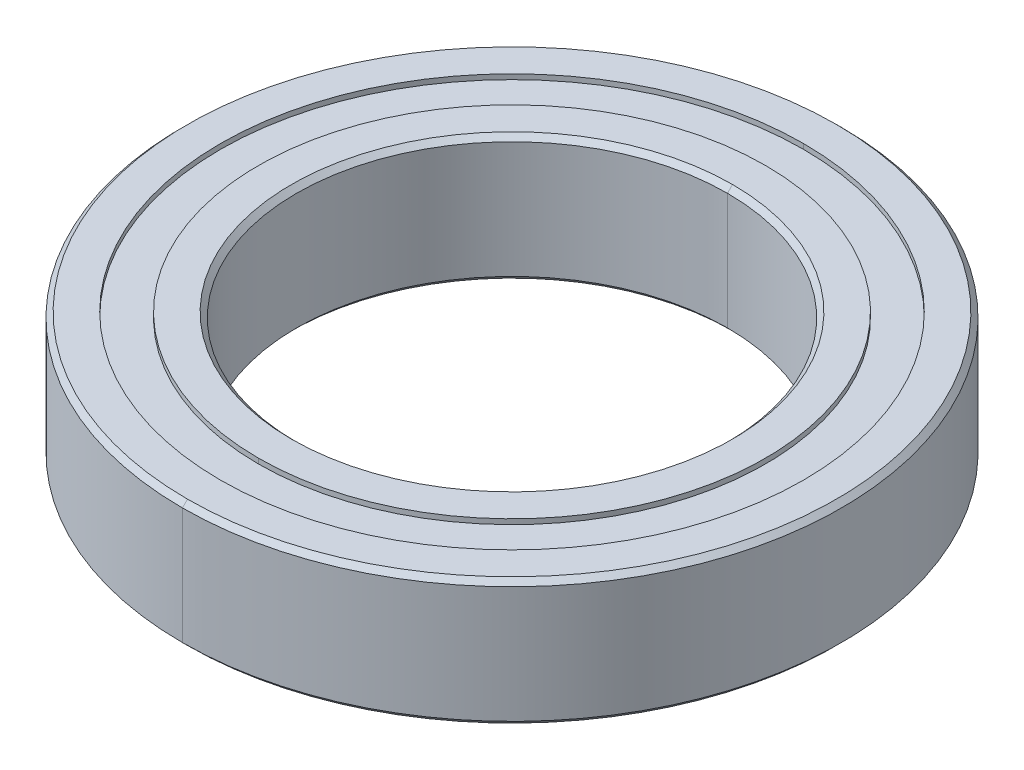
ISO-10303-21;
HEADER;
FILE_DESCRIPTION(('STEP AP214'),'2;1');
FILE_NAME('part.step','',(''),(''),'','','');
FILE_SCHEMA(('AUTOMOTIVE_DESIGN { 1 0 10303 214 1 1 1 1 }'));
ENDSEC;
DATA;
#1=APPLICATION_CONTEXT('core data for automotive mechanical design processes');
#2=APPLICATION_PROTOCOL_DEFINITION('international standard','automotive_design',2000,#1);
#3=PRODUCT_CONTEXT('',#1,'mechanical');
#4=PRODUCT('Part','Part','',(#3));
#5=PRODUCT_RELATED_PRODUCT_CATEGORY('part','',(#4));
#6=PRODUCT_DEFINITION_FORMATION('','',#4);
#7=PRODUCT_DEFINITION_CONTEXT('part definition',#1,'design');
#8=PRODUCT_DEFINITION('design','',#6,#7);
#9=PRODUCT_DEFINITION_SHAPE('','',#8);
#10=(LENGTH_UNIT() NAMED_UNIT(*) SI_UNIT(.MILLI.,.METRE.));
#11=(NAMED_UNIT(*) PLANE_ANGLE_UNIT() SI_UNIT($,.RADIAN.));
#12=(NAMED_UNIT(*) SI_UNIT($,.STERADIAN.) SOLID_ANGLE_UNIT());
#13=UNCERTAINTY_MEASURE_WITH_UNIT(LENGTH_MEASURE(1.E-05),#10,'distance_accuracy_value','');
#14=(GEOMETRIC_REPRESENTATION_CONTEXT(3) GLOBAL_UNCERTAINTY_ASSIGNED_CONTEXT((#13)) GLOBAL_UNIT_ASSIGNED_CONTEXT((#10,
#11,#12)) REPRESENTATION_CONTEXT('',''));
#15=CARTESIAN_POINT('',(0.,0.,0.));
#16=DIRECTION('',(0.,0.,1.));
#17=DIRECTION('',(1.,0.,0.));
#18=AXIS2_PLACEMENT_3D('',#15,#16,#17);
#19=CARTESIAN_POINT('',(0.,0.,0.));
#20=DIRECTION('',(0.,-1.,0.));
#21=DIRECTION('',(0.,0.,-1.));
#22=AXIS2_PLACEMENT_3D('',#19,#20,#21);
#23=CONICAL_SURFACE('',#22,8.7,0.785398163397443);
#24=DIRECTION('',(0.,-0.707106781186551,0.707106781186545));
#25=VECTOR('',#24,1.);
#26=CARTESIAN_POINT('',(0.,0.,8.7));
#27=LINE('',#26,#25);
#28=CARTESIAN_POINT('',(0.,0.2,8.5));
#29=VERTEX_POINT('',#28);
#30=CARTESIAN_POINT('',(0.,0.,8.7));
#31=VERTEX_POINT('',#30);
#32=EDGE_CURVE('E175',#29,#31,#27,.T.);
#33=ORIENTED_EDGE('',*,*,#32,.F.);
#34=CARTESIAN_POINT('',(0.,0.2,0.));
#35=DIRECTION('',(0.,-1.,0.));
#36=DIRECTION('',(0.,0.,1.));
#37=AXIS2_PLACEMENT_3D('',#34,#35,#36);
#38=CIRCLE('',#37,8.5);
#39=CARTESIAN_POINT('',(0.,0.2,-8.5));
#40=VERTEX_POINT('',#39);
#41=EDGE_CURVE('E166',#40,#29,#38,.T.);
#42=ORIENTED_EDGE('',*,*,#41,.F.);
#43=DIRECTION('',(0.,-0.707106781186551,-0.707106781186545));
#44=VECTOR('',#43,1.);
#45=CARTESIAN_POINT('',(0.,0.,-8.7));
#46=LINE('',#45,#44);
#47=CARTESIAN_POINT('',(0.,0.,-8.7));
#48=VERTEX_POINT('',#47);
#49=EDGE_CURVE('E172',#40,#48,#46,.T.);
#50=ORIENTED_EDGE('',*,*,#49,.T.);
#51=CARTESIAN_POINT('',(0.,0.,0.));
#52=DIRECTION('',(0.,1.,0.));
#53=DIRECTION('',(0.,0.,1.));
#54=AXIS2_PLACEMENT_3D('',#51,#52,#53);
#55=CIRCLE('',#54,8.7);
#56=EDGE_CURVE('E342',#31,#48,#55,.T.);
#57=ORIENTED_EDGE('',*,*,#56,.F.);
#58=EDGE_LOOP('',(#33,#42,#50,#57));
#59=FACE_BOUND('',#58,.T.);
#60=ADVANCED_FACE('F18',(#59),#23,.F.);
#61=CARTESIAN_POINT('',(0.,4.8,0.));
#62=DIRECTION('',(0.,1.,0.));
#63=DIRECTION('',(0.,0.,1.));
#64=AXIS2_PLACEMENT_3D('',#61,#62,#63);
#65=CONICAL_SURFACE('',#64,8.5,0.785398163397457);
#66=DIRECTION('',(0.,0.707106781186542,-0.707106781186554));
#67=VECTOR('',#66,1.);
#68=CARTESIAN_POINT('',(0.,4.8,-8.5));
#69=LINE('',#68,#67);
#70=CARTESIAN_POINT('',(0.,4.8,-8.5));
#71=VERTEX_POINT('',#70);
#72=CARTESIAN_POINT('',(0.,5.,-8.7));
#73=VERTEX_POINT('',#72);
#74=EDGE_CURVE('E219',#71,#73,#69,.T.);
#75=ORIENTED_EDGE('',*,*,#74,.F.);
#76=CARTESIAN_POINT('',(0.,4.8,0.));
#77=DIRECTION('',(0.,1.,0.));
#78=DIRECTION('',(0.,0.,1.));
#79=AXIS2_PLACEMENT_3D('',#76,#77,#78);
#80=CIRCLE('',#79,8.5);
#81=CARTESIAN_POINT('',(0.,4.8,8.5));
#82=VERTEX_POINT('',#81);
#83=EDGE_CURVE('E181',#82,#71,#80,.T.);
#84=ORIENTED_EDGE('',*,*,#83,.F.);
#85=DIRECTION('',(0.,0.707106781186542,0.707106781186554));
#86=VECTOR('',#85,1.);
#87=CARTESIAN_POINT('',(0.,4.8,8.5));
#88=LINE('',#87,#86);
#89=CARTESIAN_POINT('',(0.,5.,8.7));
#90=VERTEX_POINT('',#89);
#91=EDGE_CURVE('E226',#82,#90,#88,.T.);
#92=ORIENTED_EDGE('',*,*,#91,.T.);
#93=CARTESIAN_POINT('',(0.,5.,0.));
#94=DIRECTION('',(0.,-1.,0.));
#95=DIRECTION('',(0.,0.,1.));
#96=AXIS2_PLACEMENT_3D('',#93,#94,#95);
#97=CIRCLE('',#96,8.7);
#98=EDGE_CURVE('E213',#73,#90,#97,.T.);
#99=ORIENTED_EDGE('',*,*,#98,.F.);
#100=EDGE_LOOP('',(#75,#84,#92,#99));
#101=FACE_BOUND('',#100,.T.);
#102=ADVANCED_FACE('F428',(#101),#65,.F.);
#103=CARTESIAN_POINT('',(0.,0.199999999999997,0.));
#104=DIRECTION('',(0.,1.,0.));
#105=DIRECTION('',(0.,0.,1.));
#106=AXIS2_PLACEMENT_3D('',#103,#104,#105);
#107=CONICAL_SURFACE('',#106,13.,0.785398163397448);
#108=DIRECTION('',(0.,0.707106781186548,-0.707106781186548));
#109=VECTOR('',#108,1.);
#110=CARTESIAN_POINT('',(0.,0.199999999999997,-13.));
#111=LINE('',#110,#109);
#112=CARTESIAN_POINT('',(0.,0.,-12.8));
#113=VERTEX_POINT('',#112);
#114=CARTESIAN_POINT('',(0.,0.199999999999997,-13.));
#115=VERTEX_POINT('',#114);
#116=EDGE_CURVE('E223',#113,#115,#111,.T.);
#117=ORIENTED_EDGE('',*,*,#116,.F.);
#118=CARTESIAN_POINT('',(0.,0.,0.));
#119=DIRECTION('',(0.,-1.,0.));
#120=DIRECTION('',(0.,0.,1.));
#121=AXIS2_PLACEMENT_3D('',#118,#119,#120);
#122=CIRCLE('',#121,12.8);
#123=CARTESIAN_POINT('',(0.,0.,12.8));
#124=VERTEX_POINT('',#123);
#125=EDGE_CURVE('E353',#124,#113,#122,.T.);
#126=ORIENTED_EDGE('',*,*,#125,.F.);
#127=DIRECTION('',(0.,0.707106781186548,0.707106781186548));
#128=VECTOR('',#127,1.);
#129=CARTESIAN_POINT('',(0.,0.199999999999997,13.));
#130=LINE('',#129,#128);
#131=CARTESIAN_POINT('',(0.,0.199999999999997,13.));
#132=VERTEX_POINT('',#131);
#133=EDGE_CURVE('E243',#124,#132,#130,.T.);
#134=ORIENTED_EDGE('',*,*,#133,.T.);
#135=CARTESIAN_POINT('',(0.,0.199999999999997,0.));
#136=DIRECTION('',(0.,1.,0.));
#137=DIRECTION('',(0.,0.,1.));
#138=AXIS2_PLACEMENT_3D('',#135,#136,#137);
#139=CIRCLE('',#138,13.);
#140=EDGE_CURVE('E277',#115,#132,#139,.T.);
#141=ORIENTED_EDGE('',*,*,#140,.F.);
#142=EDGE_LOOP('',(#117,#126,#134,#141));
#143=FACE_BOUND('',#142,.T.);
#144=ADVANCED_FACE('F409',(#143),#107,.T.);
#145=CARTESIAN_POINT('',(0.,5.,0.));
#146=DIRECTION('',(0.,-1.,0.));
#147=DIRECTION('',(0.,0.,-1.));
#148=AXIS2_PLACEMENT_3D('',#145,#146,#147);
#149=CONICAL_SURFACE('',#148,12.8,0.785398163397461);
#150=DIRECTION('',(0.,-0.707106781186538,0.707106781186557));
#151=VECTOR('',#150,1.);
#152=CARTESIAN_POINT('',(0.,5.,12.8));
#153=LINE('',#152,#151);
#154=CARTESIAN_POINT('',(0.,5.,12.8));
#155=VERTEX_POINT('',#154);
#156=CARTESIAN_POINT('',(0.,4.8,13.));
#157=VERTEX_POINT('',#156);
#158=EDGE_CURVE('E265',#155,#157,#153,.T.);
#159=ORIENTED_EDGE('',*,*,#158,.F.);
#160=CARTESIAN_POINT('',(0.,5.,0.));
#161=DIRECTION('',(0.,1.,0.));
#162=DIRECTION('',(0.,0.,1.));
#163=AXIS2_PLACEMENT_3D('',#160,#161,#162);
#164=CIRCLE('',#163,12.8);
#165=CARTESIAN_POINT('',(0.,5.,-12.8));
#166=VERTEX_POINT('',#165);
#167=EDGE_CURVE('E216',#166,#155,#164,.T.);
#168=ORIENTED_EDGE('',*,*,#167,.F.);
#169=DIRECTION('',(0.,-0.707106781186538,-0.707106781186557));
#170=VECTOR('',#169,1.);
#171=CARTESIAN_POINT('',(0.,5.,-12.8));
#172=LINE('',#171,#170);
#173=CARTESIAN_POINT('',(0.,4.8,-13.));
#174=VERTEX_POINT('',#173);
#175=EDGE_CURVE('E272',#166,#174,#172,.T.);
#176=ORIENTED_EDGE('',*,*,#175,.T.);
#177=CARTESIAN_POINT('',(0.,4.8,0.));
#178=DIRECTION('',(0.,-1.,0.));
#179=DIRECTION('',(0.,0.,1.));
#180=AXIS2_PLACEMENT_3D('',#177,#178,#179);
#181=CIRCLE('',#180,13.);
#182=EDGE_CURVE('E358',#157,#174,#181,.T.);
#183=ORIENTED_EDGE('',*,*,#182,.F.);
#184=EDGE_LOOP('',(#159,#168,#176,#183));
#185=FACE_BOUND('',#184,.T.);
#186=ADVANCED_FACE('F396',(#185),#149,.T.);
#187=CARTESIAN_POINT('',(0.,0.2,0.));
#188=DIRECTION('',(0.,-1.,0.));
#189=DIRECTION('',(0.,0.,-1.));
#190=AXIS2_PLACEMENT_3D('',#187,#188,#189);
#191=CYLINDRICAL_SURFACE('',#190,10.);
#192=DIRECTION('',(0.,-1.,0.));
#193=VECTOR('',#192,1.);
#194=CARTESIAN_POINT('',(0.,0.2,10.));
#195=LINE('',#194,#193);
#196=CARTESIAN_POINT('',(0.,0.2,10.));
#197=VERTEX_POINT('',#196);
#198=CARTESIAN_POINT('',(0.,0.,10.));
#199=VERTEX_POINT('',#198);
#200=EDGE_CURVE('E290',#197,#199,#195,.T.);
#201=ORIENTED_EDGE('',*,*,#200,.F.);
#202=CARTESIAN_POINT('',(0.,0.2,0.));
#203=DIRECTION('',(0.,-1.,0.));
#204=DIRECTION('',(0.,0.,-1.));
#205=AXIS2_PLACEMENT_3D('',#202,#203,#204);
#206=CIRCLE('',#205,10.);
#207=CARTESIAN_POINT('',(0.,0.2,-10.));
#208=VERTEX_POINT('',#207);
#209=EDGE_CURVE('E11',#197,#208,#206,.T.);
#210=ORIENTED_EDGE('',*,*,#209,.T.);
#211=DIRECTION('',(0.,-1.,0.));
#212=VECTOR('',#211,1.);
#213=CARTESIAN_POINT('',(0.,0.2,-10.));
#214=LINE('',#213,#212);
#215=CARTESIAN_POINT('',(0.,0.,-10.));
#216=VERTEX_POINT('',#215);
#217=EDGE_CURVE('E256',#208,#216,#214,.T.);
#218=ORIENTED_EDGE('',*,*,#217,.T.);
#219=CARTESIAN_POINT('',(0.,0.,0.));
#220=DIRECTION('',(0.,-1.,0.));
#221=DIRECTION('',(0.,0.,-1.));
#222=AXIS2_PLACEMENT_3D('',#219,#220,#221);
#223=CIRCLE('',#222,10.);
#224=EDGE_CURVE('E341',#199,#216,#223,.T.);
#225=ORIENTED_EDGE('',*,*,#224,.F.);
#226=EDGE_LOOP('',(#201,#210,#218,#225));
#227=FACE_BOUND('',#226,.T.);
#228=ADVANCED_FACE('F445',(#227),#191,.T.);
#229=CARTESIAN_POINT('',(0.,0.2,0.));
#230=DIRECTION('',(0.,-1.,0.));
#231=DIRECTION('',(0.,0.,-1.));
#232=AXIS2_PLACEMENT_3D('',#229,#230,#231);
#233=PLANE('',#232);
#234=CARTESIAN_POINT('',(0.,0.2,0.));
#235=DIRECTION('',(0.,-1.,0.));
#236=DIRECTION('',(0.,0.,-1.));
#237=AXIS2_PLACEMENT_3D('',#234,#235,#236);
#238=CIRCLE('',#237,10.);
#239=EDGE_CURVE('E278',#208,#197,#238,.T.);
#240=ORIENTED_EDGE('',*,*,#239,.F.);
#241=ORIENTED_EDGE('',*,*,#209,.F.);
#242=EDGE_LOOP('',(#240,#241));
#243=FACE_BOUND('',#242,.T.);
#244=CARTESIAN_POINT('',(0.,0.2,0.));
#245=DIRECTION('',(0.,-1.,0.));
#246=DIRECTION('',(0.,0.,-1.));
#247=AXIS2_PLACEMENT_3D('',#244,#245,#246);
#248=CIRCLE('',#247,11.5);
#249=CARTESIAN_POINT('',(0.,0.2,-11.5));
#250=VERTEX_POINT('',#249);
#251=CARTESIAN_POINT('',(0.,0.2,11.5));
#252=VERTEX_POINT('',#251);
#253=EDGE_CURVE('E27',#250,#252,#248,.T.);
#254=ORIENTED_EDGE('',*,*,#253,.T.);
#255=CARTESIAN_POINT('',(0.,0.2,0.));
#256=DIRECTION('',(0.,-1.,0.));
#257=DIRECTION('',(0.,0.,-1.));
#258=AXIS2_PLACEMENT_3D('',#255,#256,#257);
#259=CIRCLE('',#258,11.5);
#260=EDGE_CURVE('E255',#252,#250,#259,.T.);
#261=ORIENTED_EDGE('',*,*,#260,.T.);
#262=EDGE_LOOP('',(#254,#261));
#263=FACE_BOUND('',#262,.T.);
#264=ADVANCED_FACE('F443',(#243,#263),#233,.T.);
#265=CARTESIAN_POINT('',(0.,0.2,0.));
#266=DIRECTION('',(0.,-1.,0.));
#267=DIRECTION('',(0.,0.,-1.));
#268=AXIS2_PLACEMENT_3D('',#265,#266,#267);
#269=CYLINDRICAL_SURFACE('',#268,11.5);
#270=DIRECTION('',(0.,-1.,0.));
#271=VECTOR('',#270,1.);
#272=CARTESIAN_POINT('',(0.,0.2,11.5));
#273=LINE('',#272,#271);
#274=CARTESIAN_POINT('',(0.,0.,11.5));
#275=VERTEX_POINT('',#274);
#276=EDGE_CURVE('E246',#252,#275,#273,.T.);
#277=ORIENTED_EDGE('',*,*,#276,.F.);
#278=ORIENTED_EDGE('',*,*,#253,.F.);
#279=DIRECTION('',(0.,-1.,0.));
#280=VECTOR('',#279,1.);
#281=CARTESIAN_POINT('',(0.,0.2,-11.5));
#282=LINE('',#281,#280);
#283=CARTESIAN_POINT('',(0.,0.,-11.5));
#284=VERTEX_POINT('',#283);
#285=EDGE_CURVE('E283',#250,#284,#282,.T.);
#286=ORIENTED_EDGE('',*,*,#285,.T.);
#287=CARTESIAN_POINT('',(0.,0.,0.));
#288=DIRECTION('',(0.,-1.,0.));
#289=DIRECTION('',(0.,0.,-1.));
#290=AXIS2_PLACEMENT_3D('',#287,#288,#289);
#291=CIRCLE('',#290,11.5);
#292=EDGE_CURVE('E360',#284,#275,#291,.T.);
#293=ORIENTED_EDGE('',*,*,#292,.T.);
#294=EDGE_LOOP('',(#277,#278,#286,#293));
#295=FACE_BOUND('',#294,.T.);
#296=ADVANCED_FACE('F448',(#295),#269,.F.);
#297=CARTESIAN_POINT('',(0.,4.8,0.));
#298=DIRECTION('',(0.,1.,0.));
#299=DIRECTION('',(0.,0.,1.));
#300=AXIS2_PLACEMENT_3D('',#297,#298,#299);
#301=CYLINDRICAL_SURFACE('',#300,10.);
#302=DIRECTION('',(0.,1.,0.));
#303=VECTOR('',#302,1.);
#304=CARTESIAN_POINT('',(0.,4.8,-10.));
#305=LINE('',#304,#303);
#306=CARTESIAN_POINT('',(0.,4.8,-10.));
#307=VERTEX_POINT('',#306);
#308=CARTESIAN_POINT('',(0.,5.,-10.));
#309=VERTEX_POINT('',#308);
#310=EDGE_CURVE('E308',#307,#309,#305,.T.);
#311=ORIENTED_EDGE('',*,*,#310,.F.);
#312=CARTESIAN_POINT('',(0.,4.8,0.));
#313=DIRECTION('',(0.,1.,0.));
#314=DIRECTION('',(0.,0.,1.));
#315=AXIS2_PLACEMENT_3D('',#312,#313,#314);
#316=CIRCLE('',#315,10.);
#317=CARTESIAN_POINT('',(0.,4.8,10.));
#318=VERTEX_POINT('',#317);
#319=EDGE_CURVE('E264',#307,#318,#316,.T.);
#320=ORIENTED_EDGE('',*,*,#319,.T.);
#321=DIRECTION('',(0.,1.,0.));
#322=VECTOR('',#321,1.);
#323=CARTESIAN_POINT('',(0.,4.8,10.));
#324=LINE('',#323,#322);
#325=CARTESIAN_POINT('',(0.,5.,10.));
#326=VERTEX_POINT('',#325);
#327=EDGE_CURVE('E314',#318,#326,#324,.T.);
#328=ORIENTED_EDGE('',*,*,#327,.T.);
#329=CARTESIAN_POINT('',(0.,5.,0.));
#330=DIRECTION('',(0.,1.,0.));
#331=DIRECTION('',(0.,0.,1.));
#332=AXIS2_PLACEMENT_3D('',#329,#330,#331);
#333=CIRCLE('',#332,10.);
#334=EDGE_CURVE('E220',#309,#326,#333,.T.);
#335=ORIENTED_EDGE('',*,*,#334,.F.);
#336=EDGE_LOOP('',(#311,#320,#328,#335));
#337=FACE_BOUND('',#336,.T.);
#338=ADVANCED_FACE('F375',(#337),#301,.T.);
#339=CARTESIAN_POINT('',(0.,4.8,0.));
#340=DIRECTION('',(0.,1.,0.));
#341=DIRECTION('',(1.,0.,0.));
#342=AXIS2_PLACEMENT_3D('',#339,#340,#341);
#343=PLANE('',#342);
#344=CARTESIAN_POINT('',(0.,4.8,0.));
#345=DIRECTION('',(0.,1.,0.));
#346=DIRECTION('',(0.,0.,1.));
#347=AXIS2_PLACEMENT_3D('',#344,#345,#346);
#348=CIRCLE('',#347,10.);
#349=EDGE_CURVE('E305',#318,#307,#348,.T.);
#350=ORIENTED_EDGE('',*,*,#349,.F.);
#351=ORIENTED_EDGE('',*,*,#319,.F.);
#352=EDGE_LOOP('',(#350,#351));
#353=FACE_BOUND('',#352,.T.);
#354=CARTESIAN_POINT('',(0.,4.8,0.));
#355=DIRECTION('',(0.,1.,0.));
#356=DIRECTION('',(0.,0.,1.));
#357=AXIS2_PLACEMENT_3D('',#354,#355,#356);
#358=CIRCLE('',#357,11.5);
#359=CARTESIAN_POINT('',(0.,4.8,11.5));
#360=VERTEX_POINT('',#359);
#361=CARTESIAN_POINT('',(0.,4.8,-11.5));
#362=VERTEX_POINT('',#361);
#363=EDGE_CURVE('E185',#360,#362,#358,.T.);
#364=ORIENTED_EDGE('',*,*,#363,.T.);
#365=CARTESIAN_POINT('',(0.,4.8,0.));
#366=DIRECTION('',(0.,1.,0.));
#367=DIRECTION('',(0.,0.,1.));
#368=AXIS2_PLACEMENT_3D('',#365,#366,#367);
#369=CIRCLE('',#368,11.5);
#370=EDGE_CURVE('E318',#362,#360,#369,.T.);
#371=ORIENTED_EDGE('',*,*,#370,.T.);
#372=EDGE_LOOP('',(#364,#371));
#373=FACE_BOUND('',#372,.T.);
#374=ADVANCED_FACE('F378',(#353,#373),#343,.T.);
#375=CARTESIAN_POINT('',(0.,4.8,0.));
#376=DIRECTION('',(0.,1.,0.));
#377=DIRECTION('',(0.,0.,1.));
#378=AXIS2_PLACEMENT_3D('',#375,#376,#377);
#379=CYLINDRICAL_SURFACE('',#378,11.5);
#380=DIRECTION('',(0.,1.,0.));
#381=VECTOR('',#380,1.);
#382=CARTESIAN_POINT('',(0.,4.8,-11.5));
#383=LINE('',#382,#381);
#384=CARTESIAN_POINT('',(0.,5.,-11.5));
#385=VERTEX_POINT('',#384);
#386=EDGE_CURVE('E325',#362,#385,#383,.T.);
#387=ORIENTED_EDGE('',*,*,#386,.F.);
#388=ORIENTED_EDGE('',*,*,#363,.F.);
#389=DIRECTION('',(0.,1.,0.));
#390=VECTOR('',#389,1.);
#391=CARTESIAN_POINT('',(0.,4.8,11.5));
#392=LINE('',#391,#390);
#393=CARTESIAN_POINT('',(0.,5.,11.5));
#394=VERTEX_POINT('',#393);
#395=EDGE_CURVE('E329',#360,#394,#392,.T.);
#396=ORIENTED_EDGE('',*,*,#395,.T.);
#397=CARTESIAN_POINT('',(0.,5.,0.));
#398=DIRECTION('',(0.,1.,0.));
#399=DIRECTION('',(0.,0.,1.));
#400=AXIS2_PLACEMENT_3D('',#397,#398,#399);
#401=CIRCLE('',#400,11.5);
#402=EDGE_CURVE('E36',#394,#385,#401,.T.);
#403=ORIENTED_EDGE('',*,*,#402,.T.);
#404=EDGE_LOOP('',(#387,#388,#396,#403));
#405=FACE_BOUND('',#404,.T.);
#406=ADVANCED_FACE('F381',(#405),#379,.F.);
#407=CARTESIAN_POINT('',(0.,5.,0.));
#408=DIRECTION('',(0.,-1.,0.));
#409=DIRECTION('',(0.,0.,-1.));
#410=AXIS2_PLACEMENT_3D('',#407,#408,#409);
#411=CYLINDRICAL_SURFACE('',#410,8.5);
#412=DIRECTION('',(0.,-1.,0.));
#413=VECTOR('',#412,1.);
#414=CARTESIAN_POINT('',(0.,5.,8.5));
#415=LINE('',#414,#413);
#416=EDGE_CURVE('E194',#82,#29,#415,.T.);
#417=ORIENTED_EDGE('',*,*,#416,.F.);
#418=ORIENTED_EDGE('',*,*,#83,.T.);
#419=DIRECTION('',(0.,-1.,0.));
#420=VECTOR('',#419,1.);
#421=CARTESIAN_POINT('',(0.,5.,-8.5));
#422=LINE('',#421,#420);
#423=EDGE_CURVE('E184',#71,#40,#422,.T.);
#424=ORIENTED_EDGE('',*,*,#423,.T.);
#425=ORIENTED_EDGE('',*,*,#41,.T.);
#426=EDGE_LOOP('',(#417,#418,#424,#425));
#427=FACE_BOUND('',#426,.T.);
#428=ADVANCED_FACE('F186',(#427),#411,.F.);
#429=CARTESIAN_POINT('',(0.,5.,0.));
#430=DIRECTION('',(0.,-1.,0.));
#431=DIRECTION('',(0.,0.,-1.));
#432=AXIS2_PLACEMENT_3D('',#429,#430,#431);
#433=CYLINDRICAL_SURFACE('',#432,13.);
#434=DIRECTION('',(0.,-1.,0.));
#435=VECTOR('',#434,1.);
#436=CARTESIAN_POINT('',(0.,5.,13.));
#437=LINE('',#436,#435);
#438=EDGE_CURVE('E195',#157,#132,#437,.T.);
#439=ORIENTED_EDGE('',*,*,#438,.F.);
#440=ORIENTED_EDGE('',*,*,#182,.T.);
#441=DIRECTION('',(0.,-1.,0.));
#442=VECTOR('',#441,1.);
#443=CARTESIAN_POINT('',(0.,5.,-13.));
#444=LINE('',#443,#442);
#445=EDGE_CURVE('E339',#174,#115,#444,.T.);
#446=ORIENTED_EDGE('',*,*,#445,.T.);
#447=ORIENTED_EDGE('',*,*,#140,.T.);
#448=EDGE_LOOP('',(#439,#440,#446,#447));
#449=FACE_BOUND('',#448,.T.);
#450=ADVANCED_FACE('F410',(#449),#433,.T.);
#451=CARTESIAN_POINT('',(0.,0.,0.));
#452=DIRECTION('',(0.,1.,0.));
#453=DIRECTION('',(1.,0.,0.));
#454=AXIS2_PLACEMENT_3D('',#451,#452,#453);
#455=PLANE('',#454);
#456=ORIENTED_EDGE('',*,*,#292,.F.);
#457=CARTESIAN_POINT('',(0.,0.,0.));
#458=DIRECTION('',(0.,-1.,0.));
#459=DIRECTION('',(0.,0.,-1.));
#460=AXIS2_PLACEMENT_3D('',#457,#458,#459);
#461=CIRCLE('',#460,11.5);
#462=EDGE_CURVE('E251',#275,#284,#461,.T.);
#463=ORIENTED_EDGE('',*,*,#462,.F.);
#464=EDGE_LOOP('',(#456,#463));
#465=FACE_BOUND('',#464,.T.);
#466=ORIENTED_EDGE('',*,*,#125,.T.);
#467=CARTESIAN_POINT('',(0.,0.,0.));
#468=DIRECTION('',(0.,-1.,0.));
#469=DIRECTION('',(0.,0.,1.));
#470=AXIS2_PLACEMENT_3D('',#467,#468,#469);
#471=CIRCLE('',#470,12.8);
#472=EDGE_CURVE('E222',#113,#124,#471,.T.);
#473=ORIENTED_EDGE('',*,*,#472,.T.);
#474=EDGE_LOOP('',(#466,#473));
#475=FACE_BOUND('',#474,.T.);
#476=ADVANCED_FACE('F391',(#465,#475),#455,.F.);
#477=CARTESIAN_POINT('',(0.,5.,0.));
#478=DIRECTION('',(0.,1.,0.));
#479=DIRECTION('',(1.,0.,0.));
#480=AXIS2_PLACEMENT_3D('',#477,#478,#479);
#481=PLANE('',#480);
#482=ORIENTED_EDGE('',*,*,#402,.F.);
#483=CARTESIAN_POINT('',(0.,5.,0.));
#484=DIRECTION('',(0.,1.,0.));
#485=DIRECTION('',(0.,0.,1.));
#486=AXIS2_PLACEMENT_3D('',#483,#484,#485);
#487=CIRCLE('',#486,11.5);
#488=EDGE_CURVE('E326',#385,#394,#487,.T.);
#489=ORIENTED_EDGE('',*,*,#488,.F.);
#490=EDGE_LOOP('',(#482,#489));
#491=FACE_BOUND('',#490,.T.);
#492=ORIENTED_EDGE('',*,*,#167,.T.);
#493=CARTESIAN_POINT('',(0.,5.,0.));
#494=DIRECTION('',(0.,1.,0.));
#495=DIRECTION('',(0.,0.,1.));
#496=AXIS2_PLACEMENT_3D('',#493,#494,#495);
#497=CIRCLE('',#496,12.8);
#498=EDGE_CURVE('E249',#155,#166,#497,.T.);
#499=ORIENTED_EDGE('',*,*,#498,.T.);
#500=EDGE_LOOP('',(#492,#499));
#501=FACE_BOUND('',#500,.T.);
#502=ADVANCED_FACE('F390',(#491,#501),#481,.T.);
#503=CARTESIAN_POINT('',(0.,5.,0.));
#504=DIRECTION('',(0.,1.,0.));
#505=DIRECTION('',(1.,0.,0.));
#506=AXIS2_PLACEMENT_3D('',#503,#504,#505);
#507=PLANE('',#506);
#508=CARTESIAN_POINT('',(0.,5.,0.));
#509=DIRECTION('',(0.,-1.,0.));
#510=DIRECTION('',(0.,0.,1.));
#511=AXIS2_PLACEMENT_3D('',#508,#509,#510);
#512=CIRCLE('',#511,8.7);
#513=EDGE_CURVE('E230',#90,#73,#512,.T.);
#514=ORIENTED_EDGE('',*,*,#513,.T.);
#515=ORIENTED_EDGE('',*,*,#98,.T.);
#516=EDGE_LOOP('',(#514,#515));
#517=FACE_BOUND('',#516,.T.);
#518=CARTESIAN_POINT('',(0.,5.,0.));
#519=DIRECTION('',(0.,1.,0.));
#520=DIRECTION('',(0.,0.,1.));
#521=AXIS2_PLACEMENT_3D('',#518,#519,#520);
#522=CIRCLE('',#521,10.);
#523=EDGE_CURVE('E309',#326,#309,#522,.T.);
#524=ORIENTED_EDGE('',*,*,#523,.T.);
#525=ORIENTED_EDGE('',*,*,#334,.T.);
#526=EDGE_LOOP('',(#524,#525));
#527=FACE_BOUND('',#526,.T.);
#528=ADVANCED_FACE('F388',(#517,#527),#507,.T.);
#529=CARTESIAN_POINT('',(0.,0.,0.));
#530=DIRECTION('',(0.,1.,0.));
#531=DIRECTION('',(1.,0.,0.));
#532=AXIS2_PLACEMENT_3D('',#529,#530,#531);
#533=PLANE('',#532);
#534=CARTESIAN_POINT('',(0.,0.,0.));
#535=DIRECTION('',(0.,1.,0.));
#536=DIRECTION('',(0.,0.,1.));
#537=AXIS2_PLACEMENT_3D('',#534,#535,#536);
#538=CIRCLE('',#537,8.7);
#539=EDGE_CURVE('E200',#48,#31,#538,.T.);
#540=ORIENTED_EDGE('',*,*,#539,.T.);
#541=ORIENTED_EDGE('',*,*,#56,.T.);
#542=EDGE_LOOP('',(#540,#541));
#543=FACE_BOUND('',#542,.T.);
#544=CARTESIAN_POINT('',(0.,0.,0.));
#545=DIRECTION('',(0.,-1.,0.));
#546=DIRECTION('',(0.,0.,-1.));
#547=AXIS2_PLACEMENT_3D('',#544,#545,#546);
#548=CIRCLE('',#547,10.);
#549=EDGE_CURVE('E291',#216,#199,#548,.T.);
#550=ORIENTED_EDGE('',*,*,#549,.T.);
#551=ORIENTED_EDGE('',*,*,#224,.T.);
#552=EDGE_LOOP('',(#550,#551));
#553=FACE_BOUND('',#552,.T.);
#554=ADVANCED_FACE('F456',(#543,#553),#533,.F.);
#555=CARTESIAN_POINT('',(0.,5.,0.));
#556=DIRECTION('',(0.,-1.,0.));
#557=DIRECTION('',(0.,0.,-1.));
#558=AXIS2_PLACEMENT_3D('',#555,#556,#557);
#559=CYLINDRICAL_SURFACE('',#558,13.);
#560=CARTESIAN_POINT('',(0.,4.8,0.));
#561=DIRECTION('',(0.,-1.,0.));
#562=DIRECTION('',(0.,0.,1.));
#563=AXIS2_PLACEMENT_3D('',#560,#561,#562);
#564=CIRCLE('',#563,13.);
#565=EDGE_CURVE('E267',#174,#157,#564,.T.);
#566=ORIENTED_EDGE('',*,*,#565,.T.);
#567=ORIENTED_EDGE('',*,*,#438,.T.);
#568=CARTESIAN_POINT('',(0.,0.199999999999997,0.));
#569=DIRECTION('',(0.,1.,0.));
#570=DIRECTION('',(0.,0.,1.));
#571=AXIS2_PLACEMENT_3D('',#568,#569,#570);
#572=CIRCLE('',#571,13.);
#573=EDGE_CURVE('E239',#132,#115,#572,.T.);
#574=ORIENTED_EDGE('',*,*,#573,.T.);
#575=ORIENTED_EDGE('',*,*,#445,.F.);
#576=EDGE_LOOP('',(#566,#567,#574,#575));
#577=FACE_BOUND('',#576,.T.);
#578=ADVANCED_FACE('F402',(#577),#559,.T.);
#579=CARTESIAN_POINT('',(0.,5.,0.));
#580=DIRECTION('',(0.,-1.,0.));
#581=DIRECTION('',(0.,0.,-1.));
#582=AXIS2_PLACEMENT_3D('',#579,#580,#581);
#583=CYLINDRICAL_SURFACE('',#582,8.5);
#584=CARTESIAN_POINT('',(0.,4.8,0.));
#585=DIRECTION('',(0.,1.,0.));
#586=DIRECTION('',(0.,0.,1.));
#587=AXIS2_PLACEMENT_3D('',#584,#585,#586);
#588=CIRCLE('',#587,8.5);
#589=EDGE_CURVE('E203',#71,#82,#588,.T.);
#590=ORIENTED_EDGE('',*,*,#589,.T.);
#591=ORIENTED_EDGE('',*,*,#416,.T.);
#592=CARTESIAN_POINT('',(0.,0.2,0.));
#593=DIRECTION('',(0.,-1.,0.));
#594=DIRECTION('',(0.,0.,1.));
#595=AXIS2_PLACEMENT_3D('',#592,#593,#594);
#596=CIRCLE('',#595,8.5);
#597=EDGE_CURVE('E197',#29,#40,#596,.T.);
#598=ORIENTED_EDGE('',*,*,#597,.T.);
#599=ORIENTED_EDGE('',*,*,#423,.F.);
#600=EDGE_LOOP('',(#590,#591,#598,#599));
#601=FACE_BOUND('',#600,.T.);
#602=ADVANCED_FACE('F201',(#601),#583,.F.);
#603=CARTESIAN_POINT('',(0.,4.8,0.));
#604=DIRECTION('',(0.,1.,0.));
#605=DIRECTION('',(0.,0.,1.));
#606=AXIS2_PLACEMENT_3D('',#603,#604,#605);
#607=CYLINDRICAL_SURFACE('',#606,11.5);
#608=ORIENTED_EDGE('',*,*,#370,.F.);
#609=ORIENTED_EDGE('',*,*,#386,.T.);
#610=ORIENTED_EDGE('',*,*,#488,.T.);
#611=ORIENTED_EDGE('',*,*,#395,.F.);
#612=EDGE_LOOP('',(#608,#609,#610,#611));
#613=FACE_BOUND('',#612,.T.);
#614=ADVANCED_FACE('F387',(#613),#607,.F.);
#615=CARTESIAN_POINT('',(0.,4.8,0.));
#616=DIRECTION('',(0.,1.,0.));
#617=DIRECTION('',(0.,0.,1.));
#618=AXIS2_PLACEMENT_3D('',#615,#616,#617);
#619=CYLINDRICAL_SURFACE('',#618,10.);
#620=ORIENTED_EDGE('',*,*,#349,.T.);
#621=ORIENTED_EDGE('',*,*,#310,.T.);
#622=ORIENTED_EDGE('',*,*,#523,.F.);
#623=ORIENTED_EDGE('',*,*,#327,.F.);
#624=EDGE_LOOP('',(#620,#621,#622,#623));
#625=FACE_BOUND('',#624,.T.);
#626=ADVANCED_FACE('F380',(#625),#619,.T.);
#627=CARTESIAN_POINT('',(0.,0.2,0.));
#628=DIRECTION('',(0.,-1.,0.));
#629=DIRECTION('',(0.,0.,-1.));
#630=AXIS2_PLACEMENT_3D('',#627,#628,#629);
#631=CYLINDRICAL_SURFACE('',#630,11.5);
#632=ORIENTED_EDGE('',*,*,#260,.F.);
#633=ORIENTED_EDGE('',*,*,#276,.T.);
#634=ORIENTED_EDGE('',*,*,#462,.T.);
#635=ORIENTED_EDGE('',*,*,#285,.F.);
#636=EDGE_LOOP('',(#632,#633,#634,#635));
#637=FACE_BOUND('',#636,.T.);
#638=ADVANCED_FACE('F464',(#637),#631,.F.);
#639=CARTESIAN_POINT('',(0.,0.2,0.));
#640=DIRECTION('',(0.,-1.,0.));
#641=DIRECTION('',(0.,0.,-1.));
#642=AXIS2_PLACEMENT_3D('',#639,#640,#641);
#643=CYLINDRICAL_SURFACE('',#642,10.);
#644=ORIENTED_EDGE('',*,*,#239,.T.);
#645=ORIENTED_EDGE('',*,*,#200,.T.);
#646=ORIENTED_EDGE('',*,*,#549,.F.);
#647=ORIENTED_EDGE('',*,*,#217,.F.);
#648=EDGE_LOOP('',(#644,#645,#646,#647));
#649=FACE_BOUND('',#648,.T.);
#650=ADVANCED_FACE('F469',(#649),#643,.T.);
#651=CARTESIAN_POINT('',(0.,5.,0.));
#652=DIRECTION('',(0.,-1.,0.));
#653=DIRECTION('',(0.,0.,-1.));
#654=AXIS2_PLACEMENT_3D('',#651,#652,#653);
#655=CONICAL_SURFACE('',#654,12.8,0.785398163397461);
#656=ORIENTED_EDGE('',*,*,#498,.F.);
#657=ORIENTED_EDGE('',*,*,#158,.T.);
#658=ORIENTED_EDGE('',*,*,#565,.F.);
#659=ORIENTED_EDGE('',*,*,#175,.F.);
#660=EDGE_LOOP('',(#656,#657,#658,#659));
#661=FACE_BOUND('',#660,.T.);
#662=ADVANCED_FACE('F405',(#661),#655,.T.);
#663=CARTESIAN_POINT('',(0.,0.199999999999997,0.));
#664=DIRECTION('',(0.,1.,0.));
#665=DIRECTION('',(0.,0.,1.));
#666=AXIS2_PLACEMENT_3D('',#663,#664,#665);
#667=CONICAL_SURFACE('',#666,13.,0.785398163397448);
#668=ORIENTED_EDGE('',*,*,#472,.F.);
#669=ORIENTED_EDGE('',*,*,#116,.T.);
#670=ORIENTED_EDGE('',*,*,#573,.F.);
#671=ORIENTED_EDGE('',*,*,#133,.F.);
#672=EDGE_LOOP('',(#668,#669,#670,#671));
#673=FACE_BOUND('',#672,.T.);
#674=ADVANCED_FACE('F411',(#673),#667,.T.);
#675=CARTESIAN_POINT('',(0.,4.8,0.));
#676=DIRECTION('',(0.,1.,0.));
#677=DIRECTION('',(0.,0.,1.));
#678=AXIS2_PLACEMENT_3D('',#675,#676,#677);
#679=CONICAL_SURFACE('',#678,8.5,0.785398163397457);
#680=ORIENTED_EDGE('',*,*,#589,.F.);
#681=ORIENTED_EDGE('',*,*,#74,.T.);
#682=ORIENTED_EDGE('',*,*,#513,.F.);
#683=ORIENTED_EDGE('',*,*,#91,.F.);
#684=EDGE_LOOP('',(#680,#681,#682,#683));
#685=FACE_BOUND('',#684,.T.);
#686=ADVANCED_FACE('F481',(#685),#679,.F.);
#687=CARTESIAN_POINT('',(0.,0.,0.));
#688=DIRECTION('',(0.,-1.,0.));
#689=DIRECTION('',(0.,0.,-1.));
#690=AXIS2_PLACEMENT_3D('',#687,#688,#689);
#691=CONICAL_SURFACE('',#690,8.7,0.785398163397443);
#692=ORIENTED_EDGE('',*,*,#597,.F.);
#693=ORIENTED_EDGE('',*,*,#32,.T.);
#694=ORIENTED_EDGE('',*,*,#539,.F.);
#695=ORIENTED_EDGE('',*,*,#49,.F.);
#696=EDGE_LOOP('',(#692,#693,#694,#695));
#697=FACE_BOUND('',#696,.T.);
#698=ADVANCED_FACE('F198',(#697),#691,.F.);
#699=CLOSED_SHELL('',(#60,#102,#144,#186,#228,#264,#296,#338,#374,#406,#428,#450,#476,#502,#528,
#554,#578,#602,#614,#626,#638,#650,#662,#674,#686,#698));
#700=MANIFOLD_SOLID_BREP('B1',#699);
#701=ADVANCED_BREP_SHAPE_REPRESENTATION('',(#18,#700),#14);
#702=SHAPE_DEFINITION_REPRESENTATION(#9,#701);
ENDSEC;
END-ISO-10303-21;
